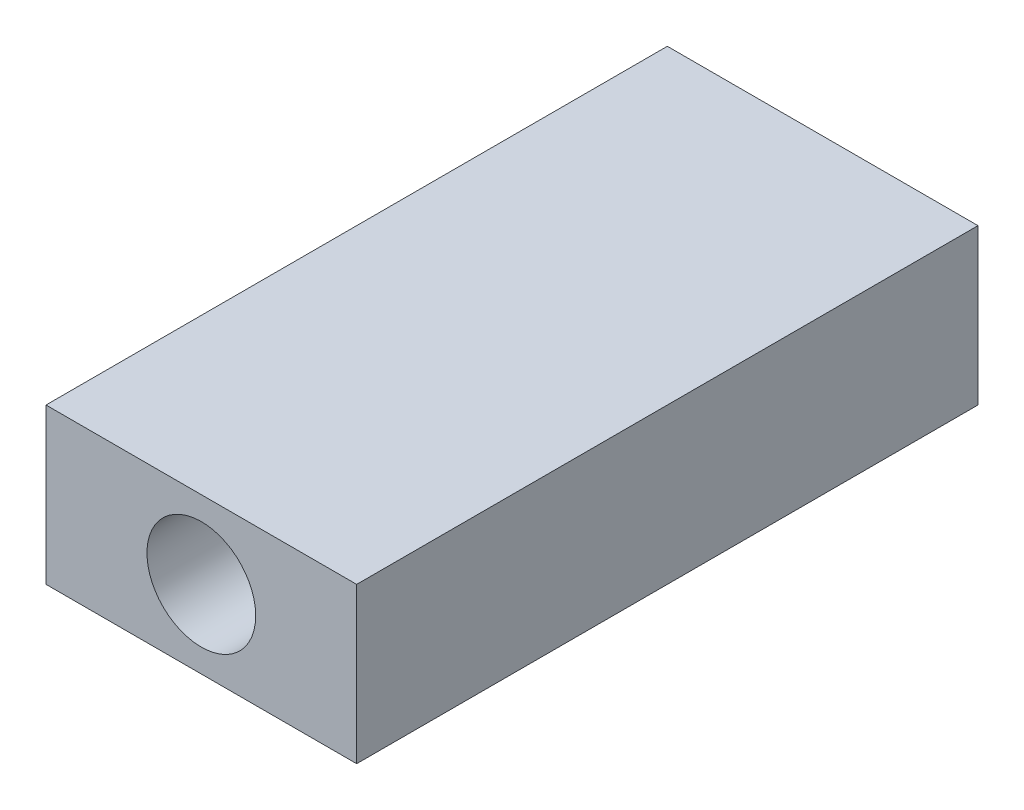
ISO-10303-21;
HEADER;
FILE_DESCRIPTION(('STEP AP214'),'2;1');
FILE_NAME('part.step','',(''),(''),'','','');
FILE_SCHEMA(('AUTOMOTIVE_DESIGN { 1 0 10303 214 1 1 1 1 }'));
ENDSEC;
DATA;
#1=APPLICATION_CONTEXT('core data for automotive mechanical design processes');
#2=APPLICATION_PROTOCOL_DEFINITION('international standard','automotive_design',2000,#1);
#3=PRODUCT_CONTEXT('',#1,'mechanical');
#4=PRODUCT('Part','Part','',(#3));
#5=PRODUCT_RELATED_PRODUCT_CATEGORY('part','',(#4));
#6=PRODUCT_DEFINITION_FORMATION('','',#4);
#7=PRODUCT_DEFINITION_CONTEXT('part definition',#1,'design');
#8=PRODUCT_DEFINITION('design','',#6,#7);
#9=PRODUCT_DEFINITION_SHAPE('','',#8);
#10=(LENGTH_UNIT() NAMED_UNIT(*) SI_UNIT(.MILLI.,.METRE.));
#11=(NAMED_UNIT(*) PLANE_ANGLE_UNIT() SI_UNIT($,.RADIAN.));
#12=(NAMED_UNIT(*) SI_UNIT($,.STERADIAN.) SOLID_ANGLE_UNIT());
#13=UNCERTAINTY_MEASURE_WITH_UNIT(LENGTH_MEASURE(1.E-05),#10,'distance_accuracy_value','');
#14=(GEOMETRIC_REPRESENTATION_CONTEXT(3) GLOBAL_UNCERTAINTY_ASSIGNED_CONTEXT((#13)) GLOBAL_UNIT_ASSIGNED_CONTEXT((#10,
#11,#12)) REPRESENTATION_CONTEXT('',''));
#15=CARTESIAN_POINT('',(0.,0.,0.));
#16=DIRECTION('',(0.,0.,1.));
#17=DIRECTION('',(1.,0.,0.));
#18=AXIS2_PLACEMENT_3D('',#15,#16,#17);
#19=CARTESIAN_POINT('',(0.,0.,40.));
#20=DIRECTION('',(0.,0.,-1.));
#21=DIRECTION('',(-1.,0.,0.));
#22=AXIS2_PLACEMENT_3D('',#19,#20,#21);
#23=PLANE('',#22);
#24=DIRECTION('',(0.,1.,0.));
#25=VECTOR('',#24,1.);
#26=CARTESIAN_POINT('',(10.0000000000001,17.025,40.));
#27=LINE('',#26,#25);
#28=CARTESIAN_POINT('',(10.0000000000001,17.025,40.));
#29=VERTEX_POINT('',#28);
#30=CARTESIAN_POINT('',(10.0000000000001,27.025,40.));
#31=VERTEX_POINT('',#30);
#32=EDGE_CURVE('E85',#29,#31,#27,.T.);
#33=ORIENTED_EDGE('',*,*,#32,.T.);
#34=DIRECTION('',(-1.,0.,0.));
#35=VECTOR('',#34,1.);
#36=CARTESIAN_POINT('',(-9.99999999999993,27.025,40.));
#37=LINE('',#36,#35);
#38=CARTESIAN_POINT('',(-9.99999999999993,27.025,40.));
#39=VERTEX_POINT('',#38);
#40=EDGE_CURVE('E80',#31,#39,#37,.T.);
#41=ORIENTED_EDGE('',*,*,#40,.T.);
#42=DIRECTION('',(0.,-1.,0.));
#43=VECTOR('',#42,1.);
#44=CARTESIAN_POINT('',(-9.99999999999993,17.025,40.));
#45=LINE('',#44,#43);
#46=CARTESIAN_POINT('',(-9.99999999999993,17.025,40.));
#47=VERTEX_POINT('',#46);
#48=EDGE_CURVE('E83',#39,#47,#45,.T.);
#49=ORIENTED_EDGE('',*,*,#48,.T.);
#50=DIRECTION('',(1.,0.,0.));
#51=VECTOR('',#50,1.);
#52=CARTESIAN_POINT('',(-9.99999999999993,17.025,40.));
#53=LINE('',#52,#51);
#54=EDGE_CURVE('E50',#47,#29,#53,.T.);
#55=ORIENTED_EDGE('',*,*,#54,.T.);
#56=EDGE_LOOP('',(#33,#41,#49,#55));
#57=FACE_BOUND('',#56,.T.);
#58=CARTESIAN_POINT('',(0.,22.025,40.));
#59=DIRECTION('',(0.,0.,1.));
#60=DIRECTION('',(1.,0.,0.));
#61=AXIS2_PLACEMENT_3D('',#58,#59,#60);
#62=CIRCLE('',#61,3.5);
#63=CARTESIAN_POINT('',(3.50000000000007,22.025,40.));
#64=VERTEX_POINT('',#63);
#65=EDGE_CURVE('E100',#64,#64,#62,.T.);
#66=ORIENTED_EDGE('',*,*,#65,.F.);
#67=EDGE_LOOP('',(#66));
#68=FACE_BOUND('',#67,.T.);
#69=ADVANCED_FACE('F33',(#57,#68),#23,.F.);
#70=CARTESIAN_POINT('',(0.,0.,0.));
#71=DIRECTION('',(0.,0.,-1.));
#72=DIRECTION('',(-1.,0.,0.));
#73=AXIS2_PLACEMENT_3D('',#70,#71,#72);
#74=PLANE('',#73);
#75=DIRECTION('',(0.,1.,0.));
#76=VECTOR('',#75,1.);
#77=CARTESIAN_POINT('',(10.0000000000001,17.025,0.));
#78=LINE('',#77,#76);
#79=CARTESIAN_POINT('',(10.0000000000001,17.025,0.));
#80=VERTEX_POINT('',#79);
#81=CARTESIAN_POINT('',(10.0000000000001,27.025,0.));
#82=VERTEX_POINT('',#81);
#83=EDGE_CURVE('E97',#80,#82,#78,.T.);
#84=ORIENTED_EDGE('',*,*,#83,.F.);
#85=DIRECTION('',(1.,0.,0.));
#86=VECTOR('',#85,1.);
#87=CARTESIAN_POINT('',(-9.99999999999993,17.025,0.));
#88=LINE('',#87,#86);
#89=CARTESIAN_POINT('',(-9.99999999999993,17.025,0.));
#90=VERTEX_POINT('',#89);
#91=EDGE_CURVE('E73',#90,#80,#88,.T.);
#92=ORIENTED_EDGE('',*,*,#91,.F.);
#93=DIRECTION('',(0.,-1.,0.));
#94=VECTOR('',#93,1.);
#95=CARTESIAN_POINT('',(-9.99999999999993,17.025,0.));
#96=LINE('',#95,#94);
#97=CARTESIAN_POINT('',(-9.99999999999993,27.025,0.));
#98=VERTEX_POINT('',#97);
#99=EDGE_CURVE('E67',#98,#90,#96,.T.);
#100=ORIENTED_EDGE('',*,*,#99,.F.);
#101=DIRECTION('',(-1.,0.,0.));
#102=VECTOR('',#101,1.);
#103=CARTESIAN_POINT('',(-9.99999999999993,27.025,0.));
#104=LINE('',#103,#102);
#105=EDGE_CURVE('E89',#82,#98,#104,.T.);
#106=ORIENTED_EDGE('',*,*,#105,.F.);
#107=EDGE_LOOP('',(#84,#92,#100,#106));
#108=FACE_BOUND('',#107,.T.);
#109=CARTESIAN_POINT('',(0.,22.025,0.));
#110=DIRECTION('',(0.,0.,1.));
#111=DIRECTION('',(1.,0.,0.));
#112=AXIS2_PLACEMENT_3D('',#109,#110,#111);
#113=CIRCLE('',#112,3.5);
#114=CARTESIAN_POINT('',(3.50000000000007,22.025,0.));
#115=VERTEX_POINT('',#114);
#116=EDGE_CURVE('E112',#115,#115,#113,.T.);
#117=ORIENTED_EDGE('',*,*,#116,.T.);
#118=EDGE_LOOP('',(#117));
#119=FACE_BOUND('',#118,.T.);
#120=ADVANCED_FACE('F108',(#108,#119),#74,.T.);
#121=CARTESIAN_POINT('',(10.0000000000001,17.025,40.));
#122=DIRECTION('',(-1.,0.,0.));
#123=DIRECTION('',(0.,0.,1.));
#124=AXIS2_PLACEMENT_3D('',#121,#122,#123);
#125=PLANE('',#124);
#126=ORIENTED_EDGE('',*,*,#83,.T.);
#127=DIRECTION('',(0.,0.,-1.));
#128=VECTOR('',#127,1.);
#129=CARTESIAN_POINT('',(10.0000000000001,27.025,40.));
#130=LINE('',#129,#128);
#131=EDGE_CURVE('E11',#31,#82,#130,.T.);
#132=ORIENTED_EDGE('',*,*,#131,.F.);
#133=ORIENTED_EDGE('',*,*,#32,.F.);
#134=DIRECTION('',(0.,0.,-1.));
#135=VECTOR('',#134,1.);
#136=CARTESIAN_POINT('',(10.0000000000001,17.025,40.));
#137=LINE('',#136,#135);
#138=EDGE_CURVE('E93',#29,#80,#137,.T.);
#139=ORIENTED_EDGE('',*,*,#138,.T.);
#140=EDGE_LOOP('',(#126,#132,#133,#139));
#141=FACE_BOUND('',#140,.T.);
#142=ADVANCED_FACE('F35',(#141),#125,.F.);
#143=CARTESIAN_POINT('',(-9.99999999999993,27.025,40.));
#144=DIRECTION('',(0.,-1.,0.));
#145=DIRECTION('',(0.,0.,-1.));
#146=AXIS2_PLACEMENT_3D('',#143,#144,#145);
#147=PLANE('',#146);
#148=ORIENTED_EDGE('',*,*,#105,.T.);
#149=DIRECTION('',(0.,0.,-1.));
#150=VECTOR('',#149,1.);
#151=CARTESIAN_POINT('',(-9.99999999999993,27.025,40.));
#152=LINE('',#151,#150);
#153=EDGE_CURVE('E42',#39,#98,#152,.T.);
#154=ORIENTED_EDGE('',*,*,#153,.F.);
#155=ORIENTED_EDGE('',*,*,#40,.F.);
#156=ORIENTED_EDGE('',*,*,#131,.T.);
#157=EDGE_LOOP('',(#148,#154,#155,#156));
#158=FACE_BOUND('',#157,.T.);
#159=ADVANCED_FACE('F88',(#158),#147,.F.);
#160=CARTESIAN_POINT('',(-9.99999999999993,17.025,40.));
#161=DIRECTION('',(1.,0.,0.));
#162=DIRECTION('',(0.,0.,-1.));
#163=AXIS2_PLACEMENT_3D('',#160,#161,#162);
#164=PLANE('',#163);
#165=ORIENTED_EDGE('',*,*,#99,.T.);
#166=DIRECTION('',(0.,0.,-1.));
#167=VECTOR('',#166,1.);
#168=CARTESIAN_POINT('',(-9.99999999999993,17.025,40.));
#169=LINE('',#168,#167);
#170=EDGE_CURVE('E90',#47,#90,#169,.T.);
#171=ORIENTED_EDGE('',*,*,#170,.F.);
#172=ORIENTED_EDGE('',*,*,#48,.F.);
#173=ORIENTED_EDGE('',*,*,#153,.T.);
#174=EDGE_LOOP('',(#165,#171,#172,#173));
#175=FACE_BOUND('',#174,.T.);
#176=ADVANCED_FACE('F91',(#175),#164,.F.);
#177=CARTESIAN_POINT('',(-9.99999999999993,17.025,40.));
#178=DIRECTION('',(0.,1.,0.));
#179=DIRECTION('',(0.,0.,1.));
#180=AXIS2_PLACEMENT_3D('',#177,#178,#179);
#181=PLANE('',#180);
#182=ORIENTED_EDGE('',*,*,#91,.T.);
#183=ORIENTED_EDGE('',*,*,#138,.F.);
#184=ORIENTED_EDGE('',*,*,#54,.F.);
#185=ORIENTED_EDGE('',*,*,#170,.T.);
#186=EDGE_LOOP('',(#182,#183,#184,#185));
#187=FACE_BOUND('',#186,.T.);
#188=ADVANCED_FACE('F105',(#187),#181,.F.);
#189=CARTESIAN_POINT('',(0.,22.025,40.));
#190=DIRECTION('',(0.,0.,-1.));
#191=DIRECTION('',(-1.,0.,0.));
#192=AXIS2_PLACEMENT_3D('',#189,#190,#191);
#193=CYLINDRICAL_SURFACE('',#192,3.5);
#194=ORIENTED_EDGE('',*,*,#65,.T.);
#195=EDGE_LOOP('',(#194));
#196=FACE_BOUND('',#195,.T.);
#197=ORIENTED_EDGE('',*,*,#116,.F.);
#198=EDGE_LOOP('',(#197));
#199=FACE_BOUND('',#198,.T.);
#200=ADVANCED_FACE('F118',(#196,#199),#193,.F.);
#201=CLOSED_SHELL('',(#69,#120,#142,#159,#176,#188,#200));
#202=MANIFOLD_SOLID_BREP('B2',#201);
#203=ADVANCED_BREP_SHAPE_REPRESENTATION('',(#18,#202),#14);
#204=SHAPE_DEFINITION_REPRESENTATION(#9,#203);
ENDSEC;
END-ISO-10303-21;
